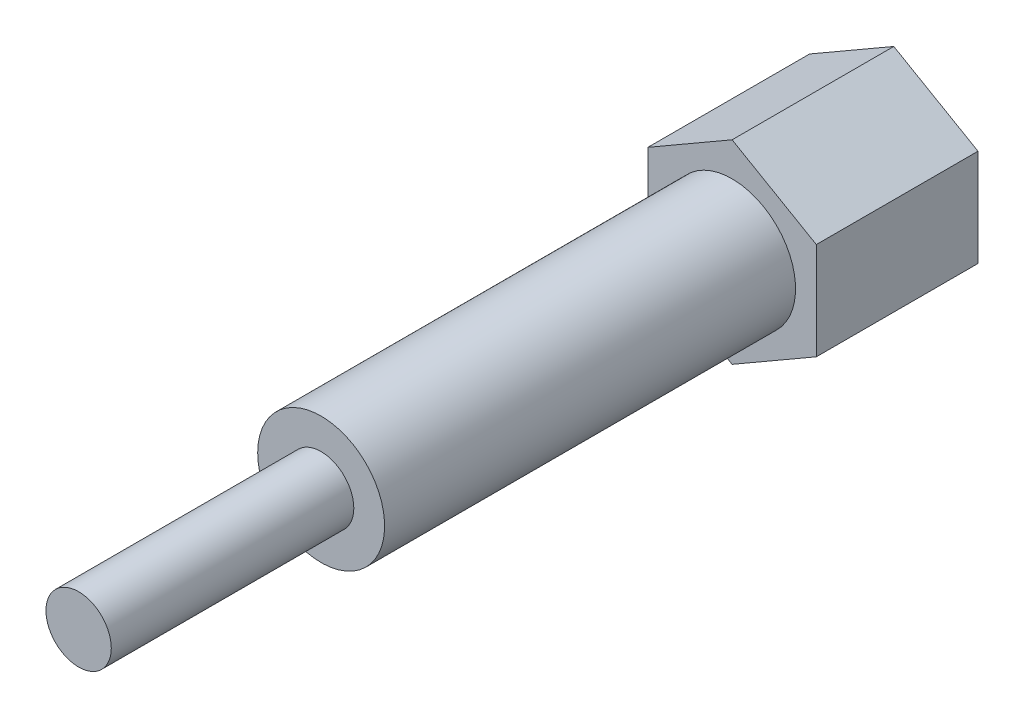
ISO-10303-21;
HEADER;
FILE_DESCRIPTION(('STEP AP214'),'2;1');
FILE_NAME('part.step','',(''),(''),'','','');
FILE_SCHEMA(('AUTOMOTIVE_DESIGN { 1 0 10303 214 1 1 1 1 }'));
ENDSEC;
DATA;
#1=APPLICATION_CONTEXT('core data for automotive mechanical design processes');
#2=APPLICATION_PROTOCOL_DEFINITION('international standard','automotive_design',2000,#1);
#3=PRODUCT_CONTEXT('',#1,'mechanical');
#4=PRODUCT('Part','Part','',(#3));
#5=PRODUCT_RELATED_PRODUCT_CATEGORY('part','',(#4));
#6=PRODUCT_DEFINITION_FORMATION('','',#4);
#7=PRODUCT_DEFINITION_CONTEXT('part definition',#1,'design');
#8=PRODUCT_DEFINITION('design','',#6,#7);
#9=PRODUCT_DEFINITION_SHAPE('','',#8);
#10=(LENGTH_UNIT() NAMED_UNIT(*) SI_UNIT(.MILLI.,.METRE.));
#11=(NAMED_UNIT(*) PLANE_ANGLE_UNIT() SI_UNIT($,.RADIAN.));
#12=(NAMED_UNIT(*) SI_UNIT($,.STERADIAN.) SOLID_ANGLE_UNIT());
#13=UNCERTAINTY_MEASURE_WITH_UNIT(LENGTH_MEASURE(1.E-05),#10,'distance_accuracy_value','');
#14=(GEOMETRIC_REPRESENTATION_CONTEXT(3) GLOBAL_UNCERTAINTY_ASSIGNED_CONTEXT((#13)) GLOBAL_UNIT_ASSIGNED_CONTEXT((#10,
#11,#12)) REPRESENTATION_CONTEXT('',''));
#15=CARTESIAN_POINT('',(0.,0.,0.));
#16=DIRECTION('',(0.,0.,1.));
#17=DIRECTION('',(1.,0.,0.));
#18=AXIS2_PLACEMENT_3D('',#15,#16,#17);
#19=CARTESIAN_POINT('',(6.25,3.60843918243517,12.));
#20=DIRECTION('',(-0.5,-0.866025403784439,0.));
#21=DIRECTION('',(0.866025403784439,-0.5,0.));
#22=AXIS2_PLACEMENT_3D('',#19,#20,#21);
#23=PLANE('',#22);
#24=DIRECTION('',(-0.866025403784439,0.5,0.));
#25=VECTOR('',#24,1.);
#26=CARTESIAN_POINT('',(6.25,3.60843918243517,0.));
#27=LINE('',#26,#25);
#28=CARTESIAN_POINT('',(6.25,3.60843918243517,0.));
#29=VERTEX_POINT('',#28);
#30=CARTESIAN_POINT('',(0.,7.21687836487032,0.));
#31=VERTEX_POINT('',#30);
#32=EDGE_CURVE('E126',#29,#31,#27,.T.);
#33=ORIENTED_EDGE('',*,*,#32,.T.);
#34=DIRECTION('',(0.,0.,-1.));
#35=VECTOR('',#34,1.);
#36=CARTESIAN_POINT('',(0.,7.21687836487032,12.));
#37=LINE('',#36,#35);
#38=CARTESIAN_POINT('',(0.,7.21687836487032,12.));
#39=VERTEX_POINT('',#38);
#40=EDGE_CURVE('E42',#39,#31,#37,.T.);
#41=ORIENTED_EDGE('',*,*,#40,.F.);
#42=DIRECTION('',(-0.866025403784439,0.5,0.));
#43=VECTOR('',#42,1.);
#44=CARTESIAN_POINT('',(6.25,3.60843918243517,12.));
#45=LINE('',#44,#43);
#46=CARTESIAN_POINT('',(6.25,3.60843918243517,12.));
#47=VERTEX_POINT('',#46);
#48=EDGE_CURVE('E137',#47,#39,#45,.T.);
#49=ORIENTED_EDGE('',*,*,#48,.F.);
#50=DIRECTION('',(0.,0.,-1.));
#51=VECTOR('',#50,1.);
#52=CARTESIAN_POINT('',(6.25,3.60843918243517,12.));
#53=LINE('',#52,#51);
#54=EDGE_CURVE('E122',#47,#29,#53,.T.);
#55=ORIENTED_EDGE('',*,*,#54,.T.);
#56=EDGE_LOOP('',(#33,#41,#49,#55));
#57=FACE_BOUND('',#56,.T.);
#58=ADVANCED_FACE('F39',(#57),#23,.F.);
#59=CARTESIAN_POINT('',(0.,7.21687836487032,12.));
#60=DIRECTION('',(0.5,-0.866025403784439,0.));
#61=DIRECTION('',(0.866025403784439,0.5,0.));
#62=AXIS2_PLACEMENT_3D('',#59,#60,#61);
#63=PLANE('',#62);
#64=DIRECTION('',(-0.866025403784439,-0.5,0.));
#65=VECTOR('',#64,1.);
#66=CARTESIAN_POINT('',(0.,7.21687836487032,0.));
#67=LINE('',#66,#65);
#68=CARTESIAN_POINT('',(-6.25,3.60843918243516,0.));
#69=VERTEX_POINT('',#68);
#70=EDGE_CURVE('E129',#31,#69,#67,.T.);
#71=ORIENTED_EDGE('',*,*,#70,.T.);
#72=DIRECTION('',(0.,0.,-1.));
#73=VECTOR('',#72,1.);
#74=CARTESIAN_POINT('',(-6.25,3.60843918243516,12.));
#75=LINE('',#74,#73);
#76=CARTESIAN_POINT('',(-6.25,3.60843918243516,12.));
#77=VERTEX_POINT('',#76);
#78=EDGE_CURVE('E140',#77,#69,#75,.T.);
#79=ORIENTED_EDGE('',*,*,#78,.F.);
#80=DIRECTION('',(-0.866025403784439,-0.5,0.));
#81=VECTOR('',#80,1.);
#82=CARTESIAN_POINT('',(0.,7.21687836487032,12.));
#83=LINE('',#82,#81);
#84=EDGE_CURVE('E95',#39,#77,#83,.T.);
#85=ORIENTED_EDGE('',*,*,#84,.F.);
#86=ORIENTED_EDGE('',*,*,#40,.T.);
#87=EDGE_LOOP('',(#71,#79,#85,#86));
#88=FACE_BOUND('',#87,.T.);
#89=ADVANCED_FACE('F153',(#88),#63,.F.);
#90=CARTESIAN_POINT('',(-6.25,3.60843918243516,12.));
#91=DIRECTION('',(1.,0.,0.));
#92=DIRECTION('',(0.,1.,0.));
#93=AXIS2_PLACEMENT_3D('',#90,#91,#92);
#94=PLANE('',#93);
#95=DIRECTION('',(0.,-1.,0.));
#96=VECTOR('',#95,1.);
#97=CARTESIAN_POINT('',(-6.25,3.60843918243516,0.));
#98=LINE('',#97,#96);
#99=CARTESIAN_POINT('',(-6.25,-3.60843918243516,0.));
#100=VERTEX_POINT('',#99);
#101=EDGE_CURVE('E132',#69,#100,#98,.T.);
#102=ORIENTED_EDGE('',*,*,#101,.T.);
#103=DIRECTION('',(0.,0.,-1.));
#104=VECTOR('',#103,1.);
#105=CARTESIAN_POINT('',(-6.25,-3.60843918243516,12.));
#106=LINE('',#105,#104);
#107=CARTESIAN_POINT('',(-6.25,-3.60843918243516,12.));
#108=VERTEX_POINT('',#107);
#109=EDGE_CURVE('E117',#108,#100,#106,.T.);
#110=ORIENTED_EDGE('',*,*,#109,.F.);
#111=DIRECTION('',(0.,-1.,0.));
#112=VECTOR('',#111,1.);
#113=CARTESIAN_POINT('',(-6.25,3.60843918243516,12.));
#114=LINE('',#113,#112);
#115=EDGE_CURVE('E108',#77,#108,#114,.T.);
#116=ORIENTED_EDGE('',*,*,#115,.F.);
#117=ORIENTED_EDGE('',*,*,#78,.T.);
#118=EDGE_LOOP('',(#102,#110,#116,#117));
#119=FACE_BOUND('',#118,.T.);
#120=ADVANCED_FACE('F154',(#119),#94,.F.);
#121=CARTESIAN_POINT('',(-6.25,-3.60843918243516,12.));
#122=DIRECTION('',(0.5,0.866025403784439,0.));
#123=DIRECTION('',(-0.866025403784439,0.5,0.));
#124=AXIS2_PLACEMENT_3D('',#121,#122,#123);
#125=PLANE('',#124);
#126=DIRECTION('',(0.866025403784439,-0.5,0.));
#127=VECTOR('',#126,1.);
#128=CARTESIAN_POINT('',(-6.25,-3.60843918243516,0.));
#129=LINE('',#128,#127);
#130=CARTESIAN_POINT('',(0.,-7.21687836487032,0.));
#131=VERTEX_POINT('',#130);
#132=EDGE_CURVE('E116',#100,#131,#129,.T.);
#133=ORIENTED_EDGE('',*,*,#132,.T.);
#134=DIRECTION('',(0.,0.,-1.));
#135=VECTOR('',#134,1.);
#136=CARTESIAN_POINT('',(0.,-7.21687836487032,12.));
#137=LINE('',#136,#135);
#138=CARTESIAN_POINT('',(0.,-7.21687836487032,12.));
#139=VERTEX_POINT('',#138);
#140=EDGE_CURVE('E113',#139,#131,#137,.T.);
#141=ORIENTED_EDGE('',*,*,#140,.F.);
#142=DIRECTION('',(0.866025403784439,-0.5,0.));
#143=VECTOR('',#142,1.);
#144=CARTESIAN_POINT('',(-6.25,-3.60843918243516,12.));
#145=LINE('',#144,#143);
#146=EDGE_CURVE('E102',#108,#139,#145,.T.);
#147=ORIENTED_EDGE('',*,*,#146,.F.);
#148=ORIENTED_EDGE('',*,*,#109,.T.);
#149=EDGE_LOOP('',(#133,#141,#147,#148));
#150=FACE_BOUND('',#149,.T.);
#151=ADVANCED_FACE('F114',(#150),#125,.F.);
#152=CARTESIAN_POINT('',(0.,-7.21687836487032,12.));
#153=DIRECTION('',(-0.5,0.866025403784439,0.));
#154=DIRECTION('',(-0.866025403784439,-0.5,0.));
#155=AXIS2_PLACEMENT_3D('',#152,#153,#154);
#156=PLANE('',#155);
#157=DIRECTION('',(0.866025403784439,0.5,0.));
#158=VECTOR('',#157,1.);
#159=CARTESIAN_POINT('',(0.,-7.21687836487032,0.));
#160=LINE('',#159,#158);
#161=CARTESIAN_POINT('',(6.25,-3.60843918243516,0.));
#162=VERTEX_POINT('',#161);
#163=EDGE_CURVE('E80',#131,#162,#160,.T.);
#164=ORIENTED_EDGE('',*,*,#163,.T.);
#165=DIRECTION('',(0.,0.,-1.));
#166=VECTOR('',#165,1.);
#167=CARTESIAN_POINT('',(6.25,-3.60843918243516,12.));
#168=LINE('',#167,#166);
#169=CARTESIAN_POINT('',(6.25,-3.60843918243516,12.));
#170=VERTEX_POINT('',#169);
#171=EDGE_CURVE('E118',#170,#162,#168,.T.);
#172=ORIENTED_EDGE('',*,*,#171,.F.);
#173=DIRECTION('',(0.866025403784439,0.5,0.));
#174=VECTOR('',#173,1.);
#175=CARTESIAN_POINT('',(0.,-7.21687836487032,12.));
#176=LINE('',#175,#174);
#177=EDGE_CURVE('E106',#139,#170,#176,.T.);
#178=ORIENTED_EDGE('',*,*,#177,.F.);
#179=ORIENTED_EDGE('',*,*,#140,.T.);
#180=EDGE_LOOP('',(#164,#172,#178,#179));
#181=FACE_BOUND('',#180,.T.);
#182=ADVANCED_FACE('F120',(#181),#156,.F.);
#183=CARTESIAN_POINT('',(6.25,-3.60843918243516,12.));
#184=DIRECTION('',(-1.,0.,0.));
#185=DIRECTION('',(0.,-1.,0.));
#186=AXIS2_PLACEMENT_3D('',#183,#184,#185);
#187=PLANE('',#186);
#188=DIRECTION('',(0.,1.,0.));
#189=VECTOR('',#188,1.);
#190=CARTESIAN_POINT('',(6.25,-3.60843918243516,0.));
#191=LINE('',#190,#189);
#192=EDGE_CURVE('E86',#162,#29,#191,.T.);
#193=ORIENTED_EDGE('',*,*,#192,.T.);
#194=ORIENTED_EDGE('',*,*,#54,.F.);
#195=DIRECTION('',(0.,1.,0.));
#196=VECTOR('',#195,1.);
#197=CARTESIAN_POINT('',(6.25,-3.60843918243516,12.));
#198=LINE('',#197,#196);
#199=EDGE_CURVE('E57',#170,#47,#198,.T.);
#200=ORIENTED_EDGE('',*,*,#199,.F.);
#201=ORIENTED_EDGE('',*,*,#171,.T.);
#202=EDGE_LOOP('',(#193,#194,#200,#201));
#203=FACE_BOUND('',#202,.T.);
#204=ADVANCED_FACE('F159',(#203),#187,.F.);
#205=CARTESIAN_POINT('',(0.,0.,12.));
#206=DIRECTION('',(0.,0.,1.));
#207=DIRECTION('',(1.,0.,0.));
#208=AXIS2_PLACEMENT_3D('',#205,#206,#207);
#209=PLANE('',#208);
#210=CARTESIAN_POINT('',(0.,0.,12.));
#211=DIRECTION('',(0.,0.,1.));
#212=DIRECTION('',(1.,0.,0.));
#213=AXIS2_PLACEMENT_3D('',#210,#211,#212);
#214=CIRCLE('',#213,4.71);
#215=CARTESIAN_POINT('',(-4.71,0.,12.));
#216=VERTEX_POINT('',#215);
#217=EDGE_CURVE('E48',#216,#216,#214,.T.);
#218=ORIENTED_EDGE('',*,*,#217,.F.);
#219=EDGE_LOOP('',(#218));
#220=FACE_BOUND('',#219,.T.);
#221=ORIENTED_EDGE('',*,*,#48,.T.);
#222=ORIENTED_EDGE('',*,*,#84,.T.);
#223=ORIENTED_EDGE('',*,*,#115,.T.);
#224=ORIENTED_EDGE('',*,*,#146,.T.);
#225=ORIENTED_EDGE('',*,*,#177,.T.);
#226=ORIENTED_EDGE('',*,*,#199,.T.);
#227=EDGE_LOOP('',(#221,#222,#223,#224,#225,#226));
#228=FACE_BOUND('',#227,.T.);
#229=ADVANCED_FACE('F104',(#220,#228),#209,.T.);
#230=CARTESIAN_POINT('',(0.,0.,0.));
#231=DIRECTION('',(0.,0.,1.));
#232=DIRECTION('',(1.,0.,0.));
#233=AXIS2_PLACEMENT_3D('',#230,#231,#232);
#234=PLANE('',#233);
#235=ORIENTED_EDGE('',*,*,#32,.F.);
#236=ORIENTED_EDGE('',*,*,#192,.F.);
#237=ORIENTED_EDGE('',*,*,#163,.F.);
#238=ORIENTED_EDGE('',*,*,#132,.F.);
#239=ORIENTED_EDGE('',*,*,#101,.F.);
#240=ORIENTED_EDGE('',*,*,#70,.F.);
#241=EDGE_LOOP('',(#235,#236,#237,#238,#239,#240));
#242=FACE_BOUND('',#241,.T.);
#243=ADVANCED_FACE('F157',(#242),#234,.F.);
#244=CARTESIAN_POINT('',(0.,0.,42.5));
#245=DIRECTION('',(0.,0.,-1.));
#246=DIRECTION('',(-1.,0.,0.));
#247=AXIS2_PLACEMENT_3D('',#244,#245,#246);
#248=CYLINDRICAL_SURFACE('',#247,4.71);
#249=CARTESIAN_POINT('',(0.,0.,42.5));
#250=DIRECTION('',(0.,0.,1.));
#251=DIRECTION('',(1.,0.,0.));
#252=AXIS2_PLACEMENT_3D('',#249,#250,#251);
#253=CIRCLE('',#252,4.71);
#254=CARTESIAN_POINT('',(-4.71,0.,42.5));
#255=VERTEX_POINT('',#254);
#256=EDGE_CURVE('E130',#255,#255,#253,.T.);
#257=CARTESIAN_POINT('',(-4.71,0.,42.5));
#258=CARTESIAN_POINT('',(-4.71,0.,42.1822916666667));
#259=CARTESIAN_POINT('',(-4.71,0.,41.8645833333333));
#260=CARTESIAN_POINT('',(-4.71,0.,41.2291666666667));
#261=CARTESIAN_POINT('',(-4.71,0.,40.9114583333333));
#262=CARTESIAN_POINT('',(-4.71,0.,40.2760416666667));
#263=CARTESIAN_POINT('',(-4.71,0.,39.9583333333333));
#264=CARTESIAN_POINT('',(-4.71,0.,39.3229166666667));
#265=CARTESIAN_POINT('',(-4.71,0.,39.0052083333333));
#266=CARTESIAN_POINT('',(-4.71,0.,38.3697916666667));
#267=CARTESIAN_POINT('',(-4.71,0.,38.0520833333333));
#268=CARTESIAN_POINT('',(-4.71,0.,37.4166666666667));
#269=CARTESIAN_POINT('',(-4.71,0.,37.0989583333333));
#270=CARTESIAN_POINT('',(-4.71,0.,36.4635416666667));
#271=CARTESIAN_POINT('',(-4.71,0.,36.1458333333333));
#272=CARTESIAN_POINT('',(-4.71,0.,35.5104166666667));
#273=CARTESIAN_POINT('',(-4.71,0.,35.1927083333333));
#274=CARTESIAN_POINT('',(-4.71,0.,34.5572916666667));
#275=CARTESIAN_POINT('',(-4.71,0.,34.2395833333333));
#276=CARTESIAN_POINT('',(-4.71,0.,33.6041666666667));
#277=CARTESIAN_POINT('',(-4.71,0.,33.2864583333333));
#278=CARTESIAN_POINT('',(-4.71,0.,32.6510416666667));
#279=CARTESIAN_POINT('',(-4.71,0.,32.3333333333333));
#280=CARTESIAN_POINT('',(-4.71,0.,31.6979166666667));
#281=CARTESIAN_POINT('',(-4.71,0.,31.3802083333333));
#282=CARTESIAN_POINT('',(-4.71,0.,30.7447916666667));
#283=CARTESIAN_POINT('',(-4.71,0.,30.4270833333333));
#284=CARTESIAN_POINT('',(-4.71,0.,29.7916666666667));
#285=CARTESIAN_POINT('',(-4.71,0.,29.4739583333333));
#286=CARTESIAN_POINT('',(-4.71,0.,28.8385416666667));
#287=CARTESIAN_POINT('',(-4.71,0.,28.5208333333333));
#288=CARTESIAN_POINT('',(-4.71,0.,27.8854166666667));
#289=CARTESIAN_POINT('',(-4.71,0.,27.5677083333333));
#290=CARTESIAN_POINT('',(-4.71,0.,26.9322916666667));
#291=CARTESIAN_POINT('',(-4.71,0.,26.6145833333333));
#292=CARTESIAN_POINT('',(-4.71,0.,25.9791666666667));
#293=CARTESIAN_POINT('',(-4.71,0.,25.6614583333333));
#294=CARTESIAN_POINT('',(-4.71,0.,25.0260416666667));
#295=CARTESIAN_POINT('',(-4.71,0.,24.7083333333333));
#296=CARTESIAN_POINT('',(-4.71,0.,24.0729166666667));
#297=CARTESIAN_POINT('',(-4.71,0.,23.7552083333333));
#298=CARTESIAN_POINT('',(-4.71,0.,23.1197916666667));
#299=CARTESIAN_POINT('',(-4.71,0.,22.8020833333333));
#300=CARTESIAN_POINT('',(-4.71,0.,22.1666666666667));
#301=CARTESIAN_POINT('',(-4.71,0.,21.8489583333333));
#302=CARTESIAN_POINT('',(-4.71,0.,21.2135416666667));
#303=CARTESIAN_POINT('',(-4.71,0.,20.8958333333333));
#304=CARTESIAN_POINT('',(-4.71,0.,20.2604166666667));
#305=CARTESIAN_POINT('',(-4.71,0.,19.9427083333333));
#306=CARTESIAN_POINT('',(-4.71,0.,19.3072916666667));
#307=CARTESIAN_POINT('',(-4.71,0.,18.9895833333333));
#308=CARTESIAN_POINT('',(-4.71,0.,18.3541666666667));
#309=CARTESIAN_POINT('',(-4.71,0.,18.0364583333333));
#310=CARTESIAN_POINT('',(-4.71,0.,17.4010416666667));
#311=CARTESIAN_POINT('',(-4.71,0.,17.0833333333333));
#312=CARTESIAN_POINT('',(-4.71,0.,16.4479166666667));
#313=CARTESIAN_POINT('',(-4.71,0.,16.1302083333333));
#314=CARTESIAN_POINT('',(-4.71,0.,15.4947916666667));
#315=CARTESIAN_POINT('',(-4.71,0.,15.1770833333333));
#316=CARTESIAN_POINT('',(-4.71,0.,14.5416666666667));
#317=CARTESIAN_POINT('',(-4.71,0.,14.2239583333333));
#318=CARTESIAN_POINT('',(-4.71,0.,13.5885416666667));
#319=CARTESIAN_POINT('',(-4.71,0.,13.2708333333333));
#320=CARTESIAN_POINT('',(-4.71,0.,12.6354166666667));
#321=CARTESIAN_POINT('',(-4.71,0.,12.3177083333333));
#322=CARTESIAN_POINT('',(-4.71,0.,12.));
#323=B_SPLINE_CURVE_WITH_KNOTS('',3,(#257,#258,#259,#260,#261,#262,#263,#264,#265,#266,#267,
#268,#269,#270,#271,#272,#273,#274,#275,#276,#277,#278,#279,#280,#281,#282,#283,#284,#285,#286,
#287,#288,#289,#290,#291,#292,#293,#294,#295,#296,#297,#298,#299,#300,#301,#302,#303,#304,#305,
#306,#307,#308,#309,#310,#311,#312,#313,#314,#315,#316,#317,#318,#319,#320,#321,#322),
.UNSPECIFIED.,.F.,.F.,(4,2,2,2,2,2,2,2,2,2,2,2,2,2,2,2,2,2,2,2,2,2,2,2,2,2,2,2,2,2,2,2,4),(0.,
0.953125000000006,1.90625000000001,2.859375,3.8125,4.765625,5.71875,6.671875,7.625,8.578125,
9.53125,10.484375,11.4375,12.390625,13.34375,14.296875,15.25,16.203125,17.15625,18.109375,
19.0625,20.015625,20.96875,21.921875,22.875,23.828125,24.78125,25.734375,26.6875,27.640625,
28.59375,29.546875,30.5),.UNSPECIFIED.);
#324=EDGE_CURVE('BSEAM210',#255,#216,#323,.T.);
#325=ORIENTED_EDGE('',*,*,#256,.F.);
#326=ORIENTED_EDGE('',*,*,#217,.T.);
#327=ORIENTED_EDGE('',*,*,#324,.T.);
#328=ORIENTED_EDGE('',*,*,#324,.F.);
#329=EDGE_LOOP('',(#325,#327,#326,#328));
#330=FACE_BOUND('',#329,.T.);
#331=ADVANCED_FACE('F210',(#330),#248,.T.);
#332=CARTESIAN_POINT('',(0.,0.,42.5));
#333=DIRECTION('',(0.,0.,1.));
#334=DIRECTION('',(1.,0.,0.));
#335=AXIS2_PLACEMENT_3D('',#332,#333,#334);
#336=PLANE('',#335);
#337=CARTESIAN_POINT('',(0.,0.,42.5));
#338=DIRECTION('',(0.,0.,1.));
#339=DIRECTION('',(1.,0.,0.));
#340=AXIS2_PLACEMENT_3D('',#337,#338,#339);
#341=CIRCLE('',#340,2.425);
#342=CARTESIAN_POINT('',(2.425,0.,42.5));
#343=VERTEX_POINT('',#342);
#344=EDGE_CURVE('E11',#343,#343,#341,.T.);
#345=ORIENTED_EDGE('',*,*,#344,.F.);
#346=EDGE_LOOP('',(#345));
#347=FACE_BOUND('',#346,.T.);
#348=ORIENTED_EDGE('',*,*,#256,.T.);
#349=EDGE_LOOP('',(#348));
#350=FACE_BOUND('',#349,.T.);
#351=ADVANCED_FACE('F217',(#347,#350),#336,.T.);
#352=CARTESIAN_POINT('',(0.,0.,60.5));
#353=DIRECTION('',(0.,0.,-1.));
#354=DIRECTION('',(-1.,0.,0.));
#355=AXIS2_PLACEMENT_3D('',#352,#353,#354);
#356=CYLINDRICAL_SURFACE('',#355,2.425);
#357=CARTESIAN_POINT('',(0.,0.,60.5));
#358=DIRECTION('',(0.,0.,1.));
#359=DIRECTION('',(1.,0.,0.));
#360=AXIS2_PLACEMENT_3D('',#357,#358,#359);
#361=CIRCLE('',#360,2.425);
#362=CARTESIAN_POINT('',(2.425,0.,60.5));
#363=VERTEX_POINT('',#362);
#364=EDGE_CURVE('E252',#363,#363,#361,.T.);
#365=ORIENTED_EDGE('',*,*,#364,.F.);
#366=EDGE_LOOP('',(#365));
#367=FACE_BOUND('',#366,.T.);
#368=ORIENTED_EDGE('',*,*,#344,.T.);
#369=EDGE_LOOP('',(#368));
#370=FACE_BOUND('',#369,.T.);
#371=ADVANCED_FACE('F227',(#367,#370),#356,.T.);
#372=CARTESIAN_POINT('',(0.,0.,60.5));
#373=DIRECTION('',(0.,0.,1.));
#374=DIRECTION('',(1.,0.,0.));
#375=AXIS2_PLACEMENT_3D('',#372,#373,#374);
#376=PLANE('',#375);
#377=ORIENTED_EDGE('',*,*,#364,.T.);
#378=EDGE_LOOP('',(#377));
#379=FACE_BOUND('',#378,.T.);
#380=ADVANCED_FACE('F237',(#379),#376,.T.);
#381=CLOSED_SHELL('',(#58,#89,#120,#151,#182,#204,#229,#243,#331,#351,#371,#380));
#382=MANIFOLD_SOLID_BREP('B2',#381);
#383=ADVANCED_BREP_SHAPE_REPRESENTATION('',(#18,#382),#14);
#384=SHAPE_DEFINITION_REPRESENTATION(#9,#383);
ENDSEC;
END-ISO-10303-21;
